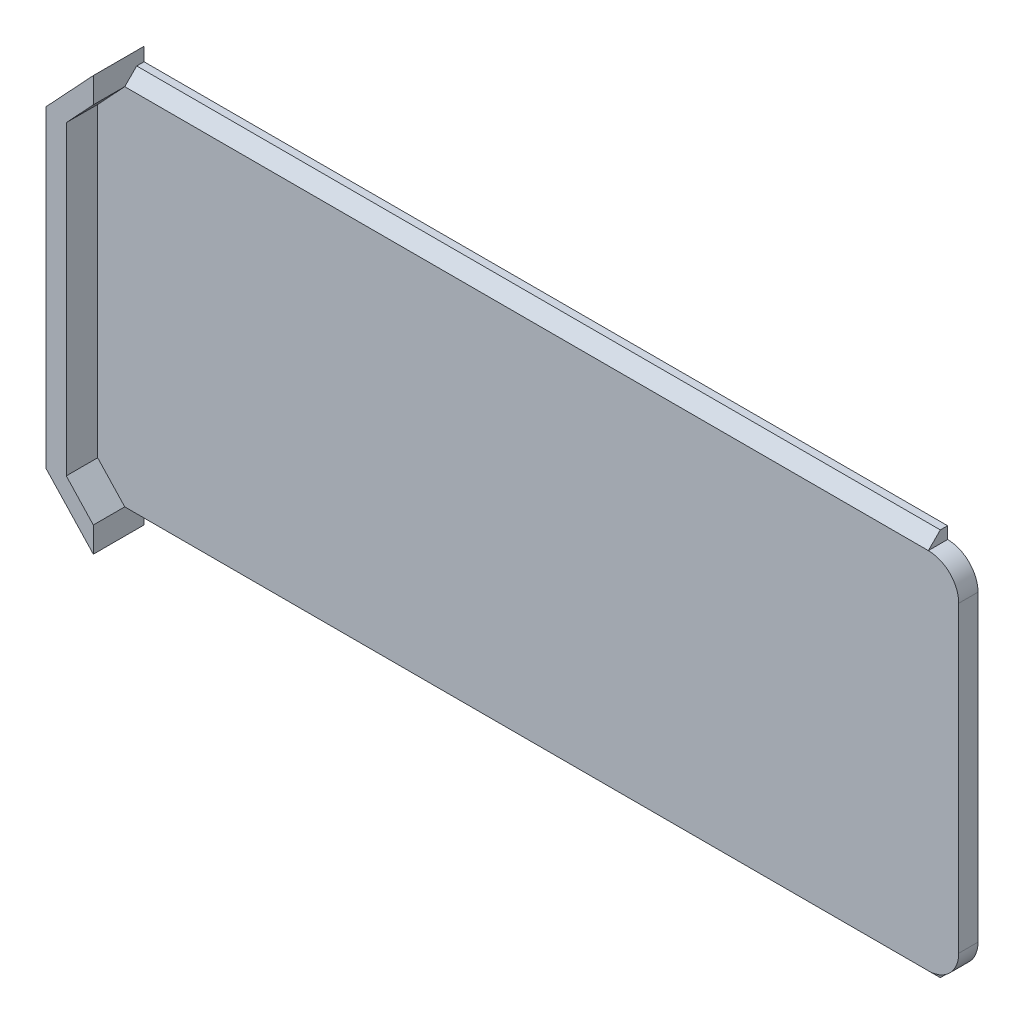
ISO-10303-21;
HEADER;
FILE_DESCRIPTION(('STEP AP214'),'2;1');
FILE_NAME('part.step','',(''),(''),'','','');
FILE_SCHEMA(('AUTOMOTIVE_DESIGN { 1 0 10303 214 1 1 1 1 }'));
ENDSEC;
DATA;
#1=APPLICATION_CONTEXT('core data for automotive mechanical design processes');
#2=APPLICATION_PROTOCOL_DEFINITION('international standard','automotive_design',2000,#1);
#3=PRODUCT_CONTEXT('',#1,'mechanical');
#4=PRODUCT('Part','Part','',(#3));
#5=PRODUCT_RELATED_PRODUCT_CATEGORY('part','',(#4));
#6=PRODUCT_DEFINITION_FORMATION('','',#4);
#7=PRODUCT_DEFINITION_CONTEXT('part definition',#1,'design');
#8=PRODUCT_DEFINITION('design','',#6,#7);
#9=PRODUCT_DEFINITION_SHAPE('','',#8);
#10=(LENGTH_UNIT() NAMED_UNIT(*) SI_UNIT(.MILLI.,.METRE.));
#11=(NAMED_UNIT(*) PLANE_ANGLE_UNIT() SI_UNIT($,.RADIAN.));
#12=(NAMED_UNIT(*) SI_UNIT($,.STERADIAN.) SOLID_ANGLE_UNIT());
#13=UNCERTAINTY_MEASURE_WITH_UNIT(LENGTH_MEASURE(1.E-05),#10,'distance_accuracy_value','');
#14=(GEOMETRIC_REPRESENTATION_CONTEXT(3) GLOBAL_UNCERTAINTY_ASSIGNED_CONTEXT((#13)) GLOBAL_UNIT_ASSIGNED_CONTEXT((#10,
#11,#12)) REPRESENTATION_CONTEXT('',''));
#15=CARTESIAN_POINT('',(0.,0.,0.));
#16=DIRECTION('',(0.,0.,1.));
#17=DIRECTION('',(1.,0.,0.));
#18=AXIS2_PLACEMENT_3D('',#15,#16,#17);
#19=CARTESIAN_POINT('',(-37.8284271247462,0.,1.9));
#20=DIRECTION('',(1.,0.,0.));
#21=DIRECTION('',(0.,0.,-1.));
#22=AXIS2_PLACEMENT_3D('',#19,#20,#21);
#23=PLANE('',#22);
#24=DIRECTION('',(0.,0.,-1.));
#25=VECTOR('',#24,1.);
#26=CARTESIAN_POINT('',(-37.8284271247462,-75.8399999999791,1.9));
#27=LINE('',#26,#25);
#28=CARTESIAN_POINT('',(-37.8284271247462,-75.8399999999791,0.72));
#29=VERTEX_POINT('',#28);
#30=CARTESIAN_POINT('',(-37.8284271247462,-75.8399999999791,0.));
#31=VERTEX_POINT('',#30);
#32=EDGE_CURVE('E179',#29,#31,#27,.T.);
#33=ORIENTED_EDGE('',*,*,#32,.F.);
#34=DIRECTION('',(0.,-0.707106781186548,-0.707106781186548));
#35=VECTOR('',#34,1.);
#36=CARTESIAN_POINT('',(-37.8284271247462,-75.8399999999791,0.720000000000006));
#37=LINE('',#36,#35);
#38=CARTESIAN_POINT('',(-37.8284271247462,-74.6599999999791,1.9));
#39=VERTEX_POINT('',#38);
#40=EDGE_CURVE('E55',#29,#39,#37,.F.);
#41=ORIENTED_EDGE('',*,*,#40,.T.);
#42=DIRECTION('',(0.,0.,-1.));
#43=VECTOR('',#42,1.);
#44=CARTESIAN_POINT('',(-37.8284271247462,-74.6599999999791,5.));
#45=LINE('',#44,#43);
#46=CARTESIAN_POINT('',(-37.8284271247462,-74.6599999999791,5.));
#47=VERTEX_POINT('',#46);
#48=EDGE_CURVE('E222',#47,#39,#45,.T.);
#49=ORIENTED_EDGE('',*,*,#48,.F.);
#50=DIRECTION('',(0.,-1.,0.));
#51=VECTOR('',#50,1.);
#52=CARTESIAN_POINT('',(-37.8284271247462,0.,5.));
#53=LINE('',#52,#51);
#54=CARTESIAN_POINT('',(-37.8284271247462,-77.1599999999791,5.));
#55=VERTEX_POINT('',#54);
#56=EDGE_CURVE('E197',#47,#55,#53,.T.);
#57=ORIENTED_EDGE('',*,*,#56,.T.);
#58=DIRECTION('',(0.,0.,-1.));
#59=VECTOR('',#58,1.);
#60=CARTESIAN_POINT('',(-37.8284271247462,-77.1599999999791,1.9));
#61=LINE('',#60,#59);
#62=CARTESIAN_POINT('',(-37.8284271247462,-77.1599999999791,0.));
#63=VERTEX_POINT('',#62);
#64=EDGE_CURVE('E239',#55,#63,#61,.T.);
#65=ORIENTED_EDGE('',*,*,#64,.T.);
#66=DIRECTION('',(0.,-1.,0.));
#67=VECTOR('',#66,1.);
#68=CARTESIAN_POINT('',(-37.8284271247462,0.,0.));
#69=LINE('',#68,#67);
#70=EDGE_CURVE('E230',#31,#63,#69,.T.);
#71=ORIENTED_EDGE('',*,*,#70,.F.);
#72=EDGE_LOOP('',(#33,#41,#49,#57,#65,#71));
#73=FACE_BOUND('',#72,.T.);
#74=ADVANCED_FACE('F43',(#73),#23,.T.);
#75=CARTESIAN_POINT('',(41.4715728752538,-71.6599999999791,1.9));
#76=DIRECTION('',(0.,0.,-1.));
#77=DIRECTION('',(-1.,0.,0.));
#78=AXIS2_PLACEMENT_3D('',#75,#76,#77);
#79=CYLINDRICAL_SURFACE('',#78,3.);
#80=CARTESIAN_POINT('',(41.4715728752538,-71.6599999999791,0.));
#81=DIRECTION('',(0.,0.,1.));
#82=DIRECTION('',(1.,0.,0.));
#83=AXIS2_PLACEMENT_3D('',#80,#81,#82);
#84=CIRCLE('',#83,3.);
#85=CARTESIAN_POINT('',(44.4715728752538,-71.6599999999791,0.));
#86=VERTEX_POINT('',#85);
#87=CARTESIAN_POINT('',(41.4715728752538,-74.6599999999791,0.));
#88=VERTEX_POINT('',#87);
#89=EDGE_CURVE('E245',#86,#88,#84,.F.);
#90=ORIENTED_EDGE('',*,*,#89,.F.);
#91=DIRECTION('',(0.,0.,-1.));
#92=VECTOR('',#91,1.);
#93=CARTESIAN_POINT('',(44.4715728752538,-71.6599999999791,1.9));
#94=LINE('',#93,#92);
#95=CARTESIAN_POINT('',(44.4715728752538,-71.6599999999791,1.9));
#96=VERTEX_POINT('',#95);
#97=EDGE_CURVE('E269',#96,#86,#94,.T.);
#98=ORIENTED_EDGE('',*,*,#97,.F.);
#99=CARTESIAN_POINT('',(41.4715728752538,-71.6599999999791,1.9));
#100=DIRECTION('',(0.,0.,1.));
#101=DIRECTION('',(1.,0.,0.));
#102=AXIS2_PLACEMENT_3D('',#99,#100,#101);
#103=CIRCLE('',#102,3.);
#104=CARTESIAN_POINT('',(41.4715728752538,-74.6599999999791,1.9));
#105=VERTEX_POINT('',#104);
#106=EDGE_CURVE('E229',#96,#105,#103,.F.);
#107=ORIENTED_EDGE('',*,*,#106,.T.);
#108=DIRECTION('',(0.,0.,-1.));
#109=VECTOR('',#108,1.);
#110=CARTESIAN_POINT('',(41.4715728752538,-74.6599999999791,1.9));
#111=LINE('',#110,#109);
#112=EDGE_CURVE('E275',#105,#88,#111,.T.);
#113=ORIENTED_EDGE('',*,*,#112,.T.);
#114=EDGE_LOOP('',(#90,#98,#107,#113));
#115=FACE_BOUND('',#114,.T.);
#116=ADVANCED_FACE('F319',(#115),#79,.T.);
#117=CARTESIAN_POINT('',(44.4715728752538,0.,1.9));
#118=DIRECTION('',(1.,0.,0.));
#119=DIRECTION('',(0.,1.,0.));
#120=AXIS2_PLACEMENT_3D('',#117,#118,#119);
#121=PLANE('',#120);
#122=DIRECTION('',(0.,-1.,0.));
#123=VECTOR('',#122,1.);
#124=CARTESIAN_POINT('',(44.4715728752538,0.,0.));
#125=LINE('',#124,#123);
#126=CARTESIAN_POINT('',(44.4715728752538,-41.7499999999791,0.));
#127=VERTEX_POINT('',#126);
#128=EDGE_CURVE('E244',#127,#86,#125,.T.);
#129=ORIENTED_EDGE('',*,*,#128,.F.);
#130=DIRECTION('',(0.,0.,-1.));
#131=VECTOR('',#130,1.);
#132=CARTESIAN_POINT('',(44.4715728752538,-41.7499999999791,1.9));
#133=LINE('',#132,#131);
#134=CARTESIAN_POINT('',(44.4715728752538,-41.7499999999791,1.9));
#135=VERTEX_POINT('',#134);
#136=EDGE_CURVE('E268',#135,#127,#133,.T.);
#137=ORIENTED_EDGE('',*,*,#136,.F.);
#138=DIRECTION('',(0.,-1.,0.));
#139=VECTOR('',#138,1.);
#140=CARTESIAN_POINT('',(44.4715728752538,0.,1.9));
#141=LINE('',#140,#139);
#142=EDGE_CURVE('E231',#135,#96,#141,.T.);
#143=ORIENTED_EDGE('',*,*,#142,.T.);
#144=ORIENTED_EDGE('',*,*,#97,.T.);
#145=EDGE_LOOP('',(#129,#137,#143,#144));
#146=FACE_BOUND('',#145,.T.);
#147=ADVANCED_FACE('F321',(#146),#121,.T.);
#148=CARTESIAN_POINT('',(41.4715728752538,-41.7499999999791,1.9));
#149=DIRECTION('',(0.,0.,-1.));
#150=DIRECTION('',(-1.,0.,0.));
#151=AXIS2_PLACEMENT_3D('',#148,#149,#150);
#152=CYLINDRICAL_SURFACE('',#151,3.);
#153=CARTESIAN_POINT('',(41.4715728752538,-41.7499999999791,0.));
#154=DIRECTION('',(0.,0.,1.));
#155=DIRECTION('',(1.,0.,0.));
#156=AXIS2_PLACEMENT_3D('',#153,#154,#155);
#157=CIRCLE('',#156,3.);
#158=CARTESIAN_POINT('',(41.4715728752538,-38.7499999999791,0.));
#159=VERTEX_POINT('',#158);
#160=EDGE_CURVE('E247',#127,#159,#157,.T.);
#161=ORIENTED_EDGE('',*,*,#160,.T.);
#162=DIRECTION('',(0.,0.,-1.));
#163=VECTOR('',#162,1.);
#164=CARTESIAN_POINT('',(41.4715728752538,-38.7499999999791,1.9));
#165=LINE('',#164,#163);
#166=CARTESIAN_POINT('',(41.4715728752538,-38.7499999999791,1.9));
#167=VERTEX_POINT('',#166);
#168=EDGE_CURVE('E177',#167,#159,#165,.T.);
#169=ORIENTED_EDGE('',*,*,#168,.F.);
#170=CARTESIAN_POINT('',(41.4715728752538,-41.7499999999791,1.9));
#171=DIRECTION('',(0.,0.,1.));
#172=DIRECTION('',(1.,0.,0.));
#173=AXIS2_PLACEMENT_3D('',#170,#171,#172);
#174=CIRCLE('',#173,3.);
#175=EDGE_CURVE('E240',#135,#167,#174,.T.);
#176=ORIENTED_EDGE('',*,*,#175,.F.);
#177=ORIENTED_EDGE('',*,*,#136,.T.);
#178=EDGE_LOOP('',(#161,#169,#176,#177));
#179=FACE_BOUND('',#178,.T.);
#180=ADVANCED_FACE('F322',(#179),#152,.T.);
#181=CARTESIAN_POINT('',(-37.8284271247462,0.,1.9));
#182=DIRECTION('',(1.,0.,0.));
#183=DIRECTION('',(0.,0.,-1.));
#184=AXIS2_PLACEMENT_3D('',#181,#182,#183);
#185=PLANE('',#184);
#186=DIRECTION('',(0.,0.,-1.));
#187=VECTOR('',#186,1.);
#188=CARTESIAN_POINT('',(-37.8284271247462,-38.7499999999791,5.));
#189=LINE('',#188,#187);
#190=CARTESIAN_POINT('',(-37.8284271247462,-38.7499999999791,5.));
#191=VERTEX_POINT('',#190);
#192=CARTESIAN_POINT('',(-37.8284271247462,-38.7499999999791,1.9));
#193=VERTEX_POINT('',#192);
#194=EDGE_CURVE('E216',#191,#193,#189,.T.);
#195=ORIENTED_EDGE('',*,*,#194,.T.);
#196=DIRECTION('',(0.,-0.707106781186548,0.707106781186548));
#197=VECTOR('',#196,1.);
#198=CARTESIAN_POINT('',(-37.8284271247462,-37.5699999999791,0.72));
#199=LINE('',#198,#197);
#200=CARTESIAN_POINT('',(-37.8284271247462,-37.5699999999791,0.719999999999999));
#201=VERTEX_POINT('',#200);
#202=EDGE_CURVE('E11',#193,#201,#199,.F.);
#203=ORIENTED_EDGE('',*,*,#202,.T.);
#204=DIRECTION('',(0.,0.,1.));
#205=VECTOR('',#204,1.);
#206=CARTESIAN_POINT('',(-37.8284271247462,-37.5699999999791,0.));
#207=LINE('',#206,#205);
#208=CARTESIAN_POINT('',(-37.8284271247462,-37.5699999999791,0.));
#209=VERTEX_POINT('',#208);
#210=EDGE_CURVE('E174',#209,#201,#207,.T.);
#211=ORIENTED_EDGE('',*,*,#210,.F.);
#212=DIRECTION('',(0.,-1.,0.));
#213=VECTOR('',#212,1.);
#214=CARTESIAN_POINT('',(-37.8284271247462,0.,0.));
#215=LINE('',#214,#213);
#216=CARTESIAN_POINT('',(-37.8284271247462,-36.2499999999791,0.));
#217=VERTEX_POINT('',#216);
#218=EDGE_CURVE('E172',#217,#209,#215,.T.);
#219=ORIENTED_EDGE('',*,*,#218,.F.);
#220=DIRECTION('',(0.,0.,-1.));
#221=VECTOR('',#220,1.);
#222=CARTESIAN_POINT('',(-37.8284271247462,-36.2499999999791,1.9));
#223=LINE('',#222,#221);
#224=CARTESIAN_POINT('',(-37.8284271247462,-36.2499999999791,5.));
#225=VERTEX_POINT('',#224);
#226=EDGE_CURVE('E264',#225,#217,#223,.T.);
#227=ORIENTED_EDGE('',*,*,#226,.F.);
#228=DIRECTION('',(0.,-1.,0.));
#229=VECTOR('',#228,1.);
#230=CARTESIAN_POINT('',(-37.8284271247462,0.,5.));
#231=LINE('',#230,#229);
#232=EDGE_CURVE('E208',#225,#191,#231,.T.);
#233=ORIENTED_EDGE('',*,*,#232,.T.);
#234=EDGE_LOOP('',(#195,#203,#211,#219,#227,#233));
#235=FACE_BOUND('',#234,.T.);
#236=ADVANCED_FACE('F326',(#235),#185,.T.);
#237=CARTESIAN_POINT('',(-2.11229490591085,1.97372207740397,1.9));
#238=DIRECTION('',(0.730667470595236,-0.682733511272121,0.));
#239=DIRECTION('',(0.682733511272121,0.730667470595236,0.));
#240=AXIS2_PLACEMENT_3D('',#237,#238,#239);
#241=PLANE('',#240);
#242=DIRECTION('',(-0.682733511272121,-0.730667470595236,0.));
#243=VECTOR('',#242,1.);
#244=CARTESIAN_POINT('',(-2.11229490591085,1.97372207740397,0.));
#245=LINE('',#244,#243);
#246=CARTESIAN_POINT('',(-42.5,-41.2495588030954,0.));
#247=VERTEX_POINT('',#246);
#248=EDGE_CURVE('E252',#217,#247,#245,.T.);
#249=ORIENTED_EDGE('',*,*,#248,.T.);
#250=DIRECTION('',(0.,0.,-1.));
#251=VECTOR('',#250,1.);
#252=CARTESIAN_POINT('',(-42.5,-41.2495588030954,1.9));
#253=LINE('',#252,#251);
#254=CARTESIAN_POINT('',(-42.5,-41.2495588030954,5.));
#255=VERTEX_POINT('',#254);
#256=EDGE_CURVE('E265',#255,#247,#253,.T.);
#257=ORIENTED_EDGE('',*,*,#256,.F.);
#258=DIRECTION('',(-0.682733511272121,-0.730667470595236,0.));
#259=VECTOR('',#258,1.);
#260=CARTESIAN_POINT('',(-2.11229490591085,1.97372207740397,5.));
#261=LINE('',#260,#259);
#262=EDGE_CURVE('E215',#225,#255,#261,.T.);
#263=ORIENTED_EDGE('',*,*,#262,.F.);
#264=ORIENTED_EDGE('',*,*,#226,.T.);
#265=EDGE_LOOP('',(#249,#257,#263,#264));
#266=FACE_BOUND('',#265,.T.);
#267=ADVANCED_FACE('F352',(#266),#241,.F.);
#268=CARTESIAN_POINT('',(-42.5,0.,1.9));
#269=DIRECTION('',(1.,0.,0.));
#270=DIRECTION('',(0.,1.,0.));
#271=AXIS2_PLACEMENT_3D('',#268,#269,#270);
#272=PLANE('',#271);
#273=DIRECTION('',(0.,-1.,0.));
#274=VECTOR('',#273,1.);
#275=CARTESIAN_POINT('',(-42.5,0.,0.));
#276=LINE('',#275,#274);
#277=CARTESIAN_POINT('',(-42.5,-72.1599999999791,0.));
#278=VERTEX_POINT('',#277);
#279=EDGE_CURVE('E254',#247,#278,#276,.T.);
#280=ORIENTED_EDGE('',*,*,#279,.T.);
#281=DIRECTION('',(0.,0.,-1.));
#282=VECTOR('',#281,1.);
#283=CARTESIAN_POINT('',(-42.5,-72.1599999999791,1.9));
#284=LINE('',#283,#282);
#285=CARTESIAN_POINT('',(-42.5,-72.1599999999791,5.));
#286=VERTEX_POINT('',#285);
#287=EDGE_CURVE('E258',#286,#278,#284,.T.);
#288=ORIENTED_EDGE('',*,*,#287,.F.);
#289=DIRECTION('',(0.,-1.,0.));
#290=VECTOR('',#289,1.);
#291=CARTESIAN_POINT('',(-42.5,0.,5.));
#292=LINE('',#291,#290);
#293=EDGE_CURVE('E191',#255,#286,#292,.T.);
#294=ORIENTED_EDGE('',*,*,#293,.F.);
#295=ORIENTED_EDGE('',*,*,#256,.T.);
#296=EDGE_LOOP('',(#280,#288,#294,#295));
#297=FACE_BOUND('',#296,.T.);
#298=ADVANCED_FACE('F357',(#297),#272,.F.);
#299=CARTESIAN_POINT('',(-58.6884369559507,-54.8334620348926,1.9));
#300=DIRECTION('',(0.730697523902946,0.682701346536027,0.));
#301=DIRECTION('',(-0.682701346536027,0.730697523902946,0.));
#302=AXIS2_PLACEMENT_3D('',#299,#300,#301);
#303=PLANE('',#302);
#304=DIRECTION('',(0.682701346536027,-0.730697523902946,0.));
#305=VECTOR('',#304,1.);
#306=CARTESIAN_POINT('',(-58.6884369559507,-54.8334620348926,0.));
#307=LINE('',#306,#305);
#308=EDGE_CURVE('E234',#278,#63,#307,.T.);
#309=ORIENTED_EDGE('',*,*,#308,.T.);
#310=ORIENTED_EDGE('',*,*,#64,.F.);
#311=DIRECTION('',(0.682701346536027,-0.730697523902946,0.));
#312=VECTOR('',#311,1.);
#313=CARTESIAN_POINT('',(-58.6884369559507,-54.8334620348926,5.));
#314=LINE('',#313,#312);
#315=EDGE_CURVE('E192',#286,#55,#314,.T.);
#316=ORIENTED_EDGE('',*,*,#315,.F.);
#317=ORIENTED_EDGE('',*,*,#287,.T.);
#318=EDGE_LOOP('',(#309,#310,#316,#317));
#319=FACE_BOUND('',#318,.T.);
#320=ADVANCED_FACE('F363',(#319),#303,.F.);
#321=CARTESIAN_POINT('',(0.,0.,1.9));
#322=DIRECTION('',(0.,0.,1.));
#323=DIRECTION('',(1.,0.,0.));
#324=AXIS2_PLACEMENT_3D('',#321,#322,#323);
#325=PLANE('',#324);
#326=DIRECTION('',(-0.682701346536026,0.730697523902947,0.));
#327=VECTOR('',#326,1.);
#328=CARTESIAN_POINT('',(-57.441316497253,-53.6682592134873,1.9));
#329=LINE('',#328,#327);
#330=CARTESIAN_POINT('',(-40.5,-71.8006066579576,1.9));
#331=VERTEX_POINT('',#330);
#332=EDGE_CURVE('E280',#39,#331,#329,.T.);
#333=ORIENTED_EDGE('',*,*,#332,.F.);
#334=DIRECTION('',(1.,0.,0.));
#335=VECTOR('',#334,1.);
#336=CARTESIAN_POINT('',(0.,-74.6599999999791,1.9));
#337=LINE('',#336,#335);
#338=EDGE_CURVE('E284',#39,#105,#337,.T.);
#339=ORIENTED_EDGE('',*,*,#338,.T.);
#340=ORIENTED_EDGE('',*,*,#106,.F.);
#341=ORIENTED_EDGE('',*,*,#142,.F.);
#342=ORIENTED_EDGE('',*,*,#175,.T.);
#343=DIRECTION('',(-1.,0.,0.));
#344=VECTOR('',#343,1.);
#345=CARTESIAN_POINT('',(0.,-38.7499999999791,1.9));
#346=LINE('',#345,#344);
#347=EDGE_CURVE('E282',#167,#193,#346,.T.);
#348=ORIENTED_EDGE('',*,*,#347,.T.);
#349=DIRECTION('',(0.682733511272122,0.730667470595235,0.));
#350=VECTOR('',#349,1.);
#351=CARTESIAN_POINT('',(-0.865166986481282,0.808409458869016,1.9));
#352=LINE('',#351,#350);
#353=CARTESIAN_POINT('',(-40.5,-41.6091410309142,1.9));
#354=VERTEX_POINT('',#353);
#355=EDGE_CURVE('E273',#354,#193,#352,.T.);
#356=ORIENTED_EDGE('',*,*,#355,.F.);
#357=DIRECTION('',(0.,1.,0.));
#358=VECTOR('',#357,1.);
#359=CARTESIAN_POINT('',(-40.5,0.,1.9));
#360=LINE('',#359,#358);
#361=EDGE_CURVE('E227',#331,#354,#360,.T.);
#362=ORIENTED_EDGE('',*,*,#361,.F.);
#363=EDGE_LOOP('',(#333,#339,#340,#341,#342,#348,#356,#362));
#364=FACE_BOUND('',#363,.T.);
#365=ADVANCED_FACE('F303',(#364),#325,.T.);
#366=CARTESIAN_POINT('',(0.,0.,0.));
#367=DIRECTION('',(0.,0.,1.));
#368=DIRECTION('',(1.,0.,0.));
#369=AXIS2_PLACEMENT_3D('',#366,#367,#368);
#370=PLANE('',#369);
#371=DIRECTION('',(0.,-1.,0.));
#372=VECTOR('',#371,1.);
#373=CARTESIAN_POINT('',(41.4715728752538,-37.5699999999791,0.));
#374=LINE('',#373,#372);
#375=CARTESIAN_POINT('',(41.4715728752538,-37.5699999999791,0.));
#376=VERTEX_POINT('',#375);
#377=EDGE_CURVE('E167',#376,#159,#374,.T.);
#378=ORIENTED_EDGE('',*,*,#377,.T.);
#379=ORIENTED_EDGE('',*,*,#160,.F.);
#380=ORIENTED_EDGE('',*,*,#128,.T.);
#381=ORIENTED_EDGE('',*,*,#89,.T.);
#382=DIRECTION('',(0.,1.,0.));
#383=VECTOR('',#382,1.);
#384=CARTESIAN_POINT('',(41.4715728752538,-75.8399999999791,0.));
#385=LINE('',#384,#383);
#386=CARTESIAN_POINT('',(41.4715728752538,-75.8399999999791,0.));
#387=VERTEX_POINT('',#386);
#388=EDGE_CURVE('E188',#387,#88,#385,.T.);
#389=ORIENTED_EDGE('',*,*,#388,.F.);
#390=DIRECTION('',(1.,0.,0.));
#391=VECTOR('',#390,1.);
#392=CARTESIAN_POINT('',(-37.8284271247462,-75.8399999999791,0.));
#393=LINE('',#392,#391);
#394=EDGE_CURVE('E185',#31,#387,#393,.T.);
#395=ORIENTED_EDGE('',*,*,#394,.F.);
#396=ORIENTED_EDGE('',*,*,#70,.T.);
#397=ORIENTED_EDGE('',*,*,#308,.F.);
#398=ORIENTED_EDGE('',*,*,#279,.F.);
#399=ORIENTED_EDGE('',*,*,#248,.F.);
#400=ORIENTED_EDGE('',*,*,#218,.T.);
#401=DIRECTION('',(-1.,0.,0.));
#402=VECTOR('',#401,1.);
#403=CARTESIAN_POINT('',(41.4715728752538,-37.5699999999791,0.));
#404=LINE('',#403,#402);
#405=EDGE_CURVE('E159',#376,#209,#404,.T.);
#406=ORIENTED_EDGE('',*,*,#405,.F.);
#407=EDGE_LOOP('',(#378,#379,#380,#381,#389,#395,#396,#397,#398,#399,#400,#406));
#408=FACE_BOUND('',#407,.T.);
#409=ADVANCED_FACE('F166',(#408),#370,.F.);
#410=CARTESIAN_POINT('',(-57.441316497253,-53.6682592134873,5.));
#411=DIRECTION('',(0.730697523902947,0.682701346536026,0.));
#412=DIRECTION('',(-0.682701346536026,0.730697523902947,0.));
#413=AXIS2_PLACEMENT_3D('',#410,#411,#412);
#414=PLANE('',#413);
#415=ORIENTED_EDGE('',*,*,#48,.T.);
#416=ORIENTED_EDGE('',*,*,#332,.T.);
#417=DIRECTION('',(0.,0.,-1.));
#418=VECTOR('',#417,1.);
#419=CARTESIAN_POINT('',(-40.5,-71.8006066579576,5.));
#420=LINE('',#419,#418);
#421=CARTESIAN_POINT('',(-40.5,-71.8006066579576,5.));
#422=VERTEX_POINT('',#421);
#423=EDGE_CURVE('E221',#422,#331,#420,.T.);
#424=ORIENTED_EDGE('',*,*,#423,.F.);
#425=DIRECTION('',(0.682701346536026,-0.730697523902947,0.));
#426=VECTOR('',#425,1.);
#427=CARTESIAN_POINT('',(-57.441316497253,-53.6682592134873,5.));
#428=LINE('',#427,#426);
#429=EDGE_CURVE('E201',#422,#47,#428,.T.);
#430=ORIENTED_EDGE('',*,*,#429,.T.);
#431=EDGE_LOOP('',(#415,#416,#424,#430));
#432=FACE_BOUND('',#431,.T.);
#433=ADVANCED_FACE('F299',(#432),#414,.T.);
#434=CARTESIAN_POINT('',(-40.5,0.,5.));
#435=DIRECTION('',(1.,0.,0.));
#436=DIRECTION('',(0.,1.,0.));
#437=AXIS2_PLACEMENT_3D('',#434,#435,#436);
#438=PLANE('',#437);
#439=ORIENTED_EDGE('',*,*,#423,.T.);
#440=ORIENTED_EDGE('',*,*,#361,.T.);
#441=DIRECTION('',(0.,0.,-1.));
#442=VECTOR('',#441,1.);
#443=CARTESIAN_POINT('',(-40.5,-41.6091410309142,5.));
#444=LINE('',#443,#442);
#445=CARTESIAN_POINT('',(-40.5,-41.6091410309142,5.));
#446=VERTEX_POINT('',#445);
#447=EDGE_CURVE('E217',#446,#354,#444,.T.);
#448=ORIENTED_EDGE('',*,*,#447,.F.);
#449=DIRECTION('',(0.,-1.,0.));
#450=VECTOR('',#449,1.);
#451=CARTESIAN_POINT('',(-40.5,0.,5.));
#452=LINE('',#451,#450);
#453=EDGE_CURVE('E202',#446,#422,#452,.T.);
#454=ORIENTED_EDGE('',*,*,#453,.T.);
#455=EDGE_LOOP('',(#439,#440,#448,#454));
#456=FACE_BOUND('',#455,.T.);
#457=ADVANCED_FACE('F371',(#456),#438,.T.);
#458=CARTESIAN_POINT('',(-0.865166986481282,0.808409458869016,5.));
#459=DIRECTION('',(0.730667470595235,-0.682733511272122,0.));
#460=DIRECTION('',(0.682733511272122,0.730667470595235,0.));
#461=AXIS2_PLACEMENT_3D('',#458,#459,#460);
#462=PLANE('',#461);
#463=ORIENTED_EDGE('',*,*,#447,.T.);
#464=ORIENTED_EDGE('',*,*,#355,.T.);
#465=ORIENTED_EDGE('',*,*,#194,.F.);
#466=DIRECTION('',(-0.682733511272122,-0.730667470595235,0.));
#467=VECTOR('',#466,1.);
#468=CARTESIAN_POINT('',(-0.865166986481282,0.808409458869016,5.));
#469=LINE('',#468,#467);
#470=EDGE_CURVE('E210',#191,#446,#469,.T.);
#471=ORIENTED_EDGE('',*,*,#470,.T.);
#472=EDGE_LOOP('',(#463,#464,#465,#471));
#473=FACE_BOUND('',#472,.T.);
#474=ADVANCED_FACE('F329',(#473),#462,.T.);
#475=CARTESIAN_POINT('',(0.,0.,5.));
#476=DIRECTION('',(0.,0.,1.));
#477=DIRECTION('',(1.,0.,0.));
#478=AXIS2_PLACEMENT_3D('',#475,#476,#477);
#479=PLANE('',#478);
#480=ORIENTED_EDGE('',*,*,#293,.T.);
#481=ORIENTED_EDGE('',*,*,#315,.T.);
#482=ORIENTED_EDGE('',*,*,#56,.F.);
#483=ORIENTED_EDGE('',*,*,#429,.F.);
#484=ORIENTED_EDGE('',*,*,#453,.F.);
#485=ORIENTED_EDGE('',*,*,#470,.F.);
#486=ORIENTED_EDGE('',*,*,#232,.F.);
#487=ORIENTED_EDGE('',*,*,#262,.T.);
#488=EDGE_LOOP('',(#480,#481,#482,#483,#484,#485,#486,#487));
#489=FACE_BOUND('',#488,.T.);
#490=ADVANCED_FACE('F380',(#489),#479,.T.);
#491=CARTESIAN_POINT('',(41.4715728752538,-75.8399999999791,0.));
#492=DIRECTION('',(-1.,0.,0.));
#493=DIRECTION('',(0.,-1.,0.));
#494=AXIS2_PLACEMENT_3D('',#491,#492,#493);
#495=PLANE('',#494);
#496=ORIENTED_EDGE('',*,*,#112,.F.);
#497=DIRECTION('',(0.,0.707106781186548,0.707106781186548));
#498=VECTOR('',#497,1.);
#499=CARTESIAN_POINT('',(41.4715728752538,-75.8399999999791,0.719999999999996));
#500=LINE('',#499,#498);
#501=CARTESIAN_POINT('',(41.4715728752538,-75.8399999999791,0.719999999999999));
#502=VERTEX_POINT('',#501);
#503=EDGE_CURVE('E290',#105,#502,#500,.F.);
#504=ORIENTED_EDGE('',*,*,#503,.T.);
#505=DIRECTION('',(0.,0.,1.));
#506=VECTOR('',#505,1.);
#507=CARTESIAN_POINT('',(41.4715728752538,-75.8399999999791,0.));
#508=LINE('',#507,#506);
#509=EDGE_CURVE('E190',#387,#502,#508,.T.);
#510=ORIENTED_EDGE('',*,*,#509,.F.);
#511=ORIENTED_EDGE('',*,*,#388,.T.);
#512=EDGE_LOOP('',(#496,#504,#510,#511));
#513=FACE_BOUND('',#512,.T.);
#514=ADVANCED_FACE('F311',(#513),#495,.F.);
#515=CARTESIAN_POINT('',(0.,-75.8399999999791,0.));
#516=DIRECTION('',(0.,-1.,0.));
#517=DIRECTION('',(1.,0.,0.));
#518=AXIS2_PLACEMENT_3D('',#515,#516,#517);
#519=PLANE('',#518);
#520=ORIENTED_EDGE('',*,*,#509,.T.);
#521=DIRECTION('',(-1.,0.,0.));
#522=VECTOR('',#521,1.);
#523=CARTESIAN_POINT('',(0.,-75.8399999999791,0.72));
#524=LINE('',#523,#522);
#525=EDGE_CURVE('E277',#502,#29,#524,.T.);
#526=ORIENTED_EDGE('',*,*,#525,.T.);
#527=ORIENTED_EDGE('',*,*,#32,.T.);
#528=ORIENTED_EDGE('',*,*,#394,.T.);
#529=EDGE_LOOP('',(#520,#526,#527,#528));
#530=FACE_BOUND('',#529,.T.);
#531=ADVANCED_FACE('F312',(#530),#519,.T.);
#532=CARTESIAN_POINT('',(41.4715728752538,-37.5699999999791,1.9));
#533=DIRECTION('',(-1.,0.,0.));
#534=DIRECTION('',(0.,0.,1.));
#535=AXIS2_PLACEMENT_3D('',#532,#533,#534);
#536=PLANE('',#535);
#537=DIRECTION('',(0.,0.,-1.));
#538=VECTOR('',#537,1.);
#539=CARTESIAN_POINT('',(41.4715728752538,-37.5699999999791,1.9));
#540=LINE('',#539,#538);
#541=CARTESIAN_POINT('',(41.4715728752538,-37.5699999999791,0.72));
#542=VERTEX_POINT('',#541);
#543=EDGE_CURVE('E160',#542,#376,#540,.T.);
#544=ORIENTED_EDGE('',*,*,#543,.F.);
#545=DIRECTION('',(0.,0.707106781186548,-0.707106781186548));
#546=VECTOR('',#545,1.);
#547=CARTESIAN_POINT('',(41.4715728752538,-37.5699999999791,0.72));
#548=LINE('',#547,#546);
#549=EDGE_CURVE('E62',#542,#167,#548,.F.);
#550=ORIENTED_EDGE('',*,*,#549,.T.);
#551=ORIENTED_EDGE('',*,*,#168,.T.);
#552=ORIENTED_EDGE('',*,*,#377,.F.);
#553=EDGE_LOOP('',(#544,#550,#551,#552));
#554=FACE_BOUND('',#553,.T.);
#555=ADVANCED_FACE('F180',(#554),#536,.F.);
#556=CARTESIAN_POINT('',(0.,-37.5699999999791,0.));
#557=DIRECTION('',(0.,1.,0.));
#558=DIRECTION('',(0.,0.,1.));
#559=AXIS2_PLACEMENT_3D('',#556,#557,#558);
#560=PLANE('',#559);
#561=ORIENTED_EDGE('',*,*,#210,.T.);
#562=DIRECTION('',(1.,0.,0.));
#563=VECTOR('',#562,1.);
#564=CARTESIAN_POINT('',(0.,-37.5699999999791,0.72));
#565=LINE('',#564,#563);
#566=EDGE_CURVE('E163',#201,#542,#565,.T.);
#567=ORIENTED_EDGE('',*,*,#566,.T.);
#568=ORIENTED_EDGE('',*,*,#543,.T.);
#569=ORIENTED_EDGE('',*,*,#405,.T.);
#570=EDGE_LOOP('',(#561,#567,#568,#569));
#571=FACE_BOUND('',#570,.T.);
#572=ADVANCED_FACE('F157',(#571),#560,.T.);
#573=CARTESIAN_POINT('',(0.,-75.8399999999791,0.72));
#574=DIRECTION('',(0.,0.707106781186548,-0.707106781186548));
#575=DIRECTION('',(-1.,0.,0.));
#576=AXIS2_PLACEMENT_3D('',#573,#574,#575);
#577=PLANE('',#576);
#578=ORIENTED_EDGE('',*,*,#503,.F.);
#579=ORIENTED_EDGE('',*,*,#338,.F.);
#580=ORIENTED_EDGE('',*,*,#40,.F.);
#581=ORIENTED_EDGE('',*,*,#525,.F.);
#582=EDGE_LOOP('',(#578,#579,#580,#581));
#583=FACE_BOUND('',#582,.T.);
#584=ADVANCED_FACE('F308',(#583),#577,.F.);
#585=CARTESIAN_POINT('',(0.,-37.5699999999791,0.72));
#586=DIRECTION('',(0.,-0.707106781186548,-0.707106781186548));
#587=DIRECTION('',(1.,0.,0.));
#588=AXIS2_PLACEMENT_3D('',#585,#586,#587);
#589=PLANE('',#588);
#590=ORIENTED_EDGE('',*,*,#202,.F.);
#591=ORIENTED_EDGE('',*,*,#347,.F.);
#592=ORIENTED_EDGE('',*,*,#549,.F.);
#593=ORIENTED_EDGE('',*,*,#566,.F.);
#594=EDGE_LOOP('',(#590,#591,#592,#593));
#595=FACE_BOUND('',#594,.T.);
#596=ADVANCED_FACE('F46',(#595),#589,.F.);
#597=CLOSED_SHELL('',(#74,#116,#147,#180,#236,#267,#298,#320,#365,#409,#433,#457,#474,#490,#514,
#531,#555,#572,#584,#596));
#598=MANIFOLD_SOLID_BREP('B2',#597);
#599=ADVANCED_BREP_SHAPE_REPRESENTATION('',(#18,#598),#14);
#600=SHAPE_DEFINITION_REPRESENTATION(#9,#599);
ENDSEC;
END-ISO-10303-21;
